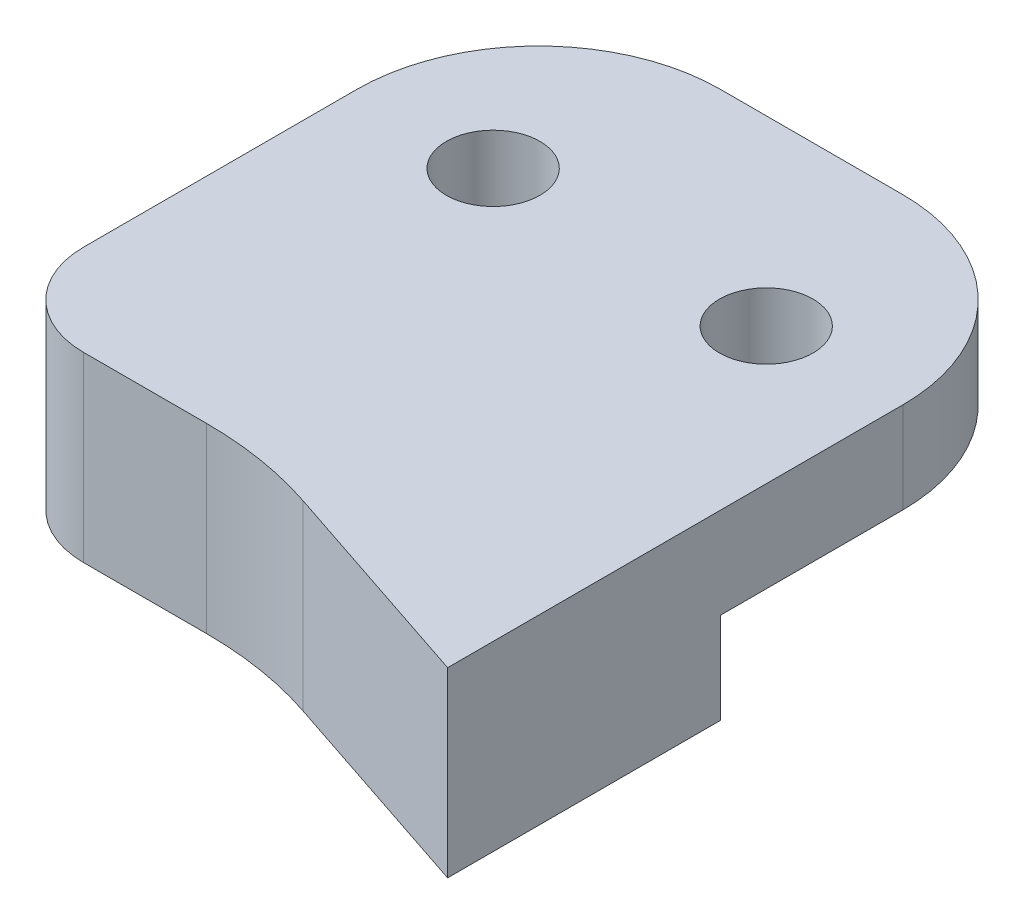
ISO-10303-21;
HEADER;
FILE_DESCRIPTION(('STEP AP214'),'2;1');
FILE_NAME('part.step','',(''),(''),'','','');
FILE_SCHEMA(('AUTOMOTIVE_DESIGN { 1 0 10303 214 1 1 1 1 }'));
ENDSEC;
DATA;
#1=APPLICATION_CONTEXT('core data for automotive mechanical design processes');
#2=APPLICATION_PROTOCOL_DEFINITION('international standard','automotive_design',2000,#1);
#3=PRODUCT_CONTEXT('',#1,'mechanical');
#4=PRODUCT('Part','Part','',(#3));
#5=PRODUCT_RELATED_PRODUCT_CATEGORY('part','',(#4));
#6=PRODUCT_DEFINITION_FORMATION('','',#4);
#7=PRODUCT_DEFINITION_CONTEXT('part definition',#1,'design');
#8=PRODUCT_DEFINITION('design','',#6,#7);
#9=PRODUCT_DEFINITION_SHAPE('','',#8);
#10=(LENGTH_UNIT() NAMED_UNIT(*) SI_UNIT(.MILLI.,.METRE.));
#11=(NAMED_UNIT(*) PLANE_ANGLE_UNIT() SI_UNIT($,.RADIAN.));
#12=(NAMED_UNIT(*) SI_UNIT($,.STERADIAN.) SOLID_ANGLE_UNIT());
#13=UNCERTAINTY_MEASURE_WITH_UNIT(LENGTH_MEASURE(1.E-05),#10,'distance_accuracy_value','');
#14=(GEOMETRIC_REPRESENTATION_CONTEXT(3) GLOBAL_UNCERTAINTY_ASSIGNED_CONTEXT((#13)) GLOBAL_UNIT_ASSIGNED_CONTEXT((#10,
#11,#12)) REPRESENTATION_CONTEXT('',''));
#15=CARTESIAN_POINT('',(0.,0.,0.));
#16=DIRECTION('',(0.,0.,1.));
#17=DIRECTION('',(1.,0.,0.));
#18=AXIS2_PLACEMENT_3D('',#15,#16,#17);
#19=CARTESIAN_POINT('',(0.,0.,0.));
#20=DIRECTION('',(0.,1.,0.));
#21=DIRECTION('',(0.,0.,1.));
#22=AXIS2_PLACEMENT_3D('',#19,#20,#21);
#23=PLANE('',#22);
#24=CARTESIAN_POINT('',(9.52500000000001,0.,-6.34999999999999));
#25=DIRECTION('',(0.,1.,0.));
#26=DIRECTION('',(0.,0.,1.));
#27=AXIS2_PLACEMENT_3D('',#24,#25,#26);
#28=CIRCLE('',#27,3.2639);
#29=CARTESIAN_POINT('',(9.52500000000001,0.,-3.08609999999999));
#30=VERTEX_POINT('',#29);
#31=EDGE_CURVE('E173',#30,#30,#28,.F.);
#32=ORIENTED_EDGE('',*,*,#31,.F.);
#33=EDGE_LOOP('',(#32));
#34=FACE_BOUND('',#33,.T.);
#35=CARTESIAN_POINT('',(-9.525,0.,-6.34999999999999));
#36=DIRECTION('',(0.,1.,0.));
#37=DIRECTION('',(0.,0.,1.));
#38=AXIS2_PLACEMENT_3D('',#35,#36,#37);
#39=CIRCLE('',#38,3.2639);
#40=CARTESIAN_POINT('',(-9.525,0.,-3.08609999999999));
#41=VERTEX_POINT('',#40);
#42=EDGE_CURVE('E195',#41,#41,#39,.T.);
#43=ORIENTED_EDGE('',*,*,#42,.T.);
#44=EDGE_LOOP('',(#43));
#45=FACE_BOUND('',#44,.T.);
#46=DIRECTION('',(-1.,0.,0.));
#47=VECTOR('',#46,1.);
#48=CARTESIAN_POINT('',(0.,0.,-19.05));
#49=LINE('',#48,#47);
#50=CARTESIAN_POINT('',(6.35,0.,-19.05));
#51=VERTEX_POINT('',#50);
#52=CARTESIAN_POINT('',(-6.35,0.,-19.05));
#53=VERTEX_POINT('',#52);
#54=EDGE_CURVE('E192',#51,#53,#49,.T.);
#55=ORIENTED_EDGE('',*,*,#54,.F.);
#56=CARTESIAN_POINT('',(6.35,0.,-6.34999999999999));
#57=DIRECTION('',(0.,1.,0.));
#58=DIRECTION('',(0.,0.,1.));
#59=AXIS2_PLACEMENT_3D('',#56,#57,#58);
#60=CIRCLE('',#59,12.7);
#61=CARTESIAN_POINT('',(19.05,0.,-6.34999999999999));
#62=VERTEX_POINT('',#61);
#63=EDGE_CURVE('E218',#51,#62,#60,.F.);
#64=ORIENTED_EDGE('',*,*,#63,.T.);
#65=DIRECTION('',(0.,0.,-1.));
#66=VECTOR('',#65,1.);
#67=CARTESIAN_POINT('',(19.05,0.,0.));
#68=LINE('',#67,#66);
#69=CARTESIAN_POINT('',(19.05,0.,6.35000000000001));
#70=VERTEX_POINT('',#69);
#71=EDGE_CURVE('E190',#70,#62,#68,.T.);
#72=ORIENTED_EDGE('',*,*,#71,.F.);
#73=DIRECTION('',(1.,0.,0.));
#74=VECTOR('',#73,1.);
#75=CARTESIAN_POINT('',(0.,0.,6.35000000000001));
#76=LINE('',#75,#74);
#77=CARTESIAN_POINT('',(-19.05,0.,6.35000000000001));
#78=VERTEX_POINT('',#77);
#79=EDGE_CURVE('E146',#78,#70,#76,.T.);
#80=ORIENTED_EDGE('',*,*,#79,.F.);
#81=DIRECTION('',(0.,0.,-1.));
#82=VECTOR('',#81,1.);
#83=CARTESIAN_POINT('',(-19.05,0.,0.));
#84=LINE('',#83,#82);
#85=CARTESIAN_POINT('',(-19.05,0.,-6.34999999999999));
#86=VERTEX_POINT('',#85);
#87=EDGE_CURVE('E167',#78,#86,#84,.T.);
#88=ORIENTED_EDGE('',*,*,#87,.T.);
#89=CARTESIAN_POINT('',(-6.35,0.,-6.34999999999999));
#90=DIRECTION('',(0.,1.,0.));
#91=DIRECTION('',(0.,0.,1.));
#92=AXIS2_PLACEMENT_3D('',#89,#90,#91);
#93=CIRCLE('',#92,12.7);
#94=EDGE_CURVE('E216',#86,#53,#93,.F.);
#95=ORIENTED_EDGE('',*,*,#94,.T.);
#96=EDGE_LOOP('',(#55,#64,#72,#80,#88,#95));
#97=FACE_BOUND('',#96,.T.);
#98=ADVANCED_FACE('F39',(#34,#45,#97),#23,.F.);
#99=CARTESIAN_POINT('',(-19.05,6.35,0.));
#100=DIRECTION('',(-1.,0.,0.));
#101=DIRECTION('',(0.,0.,1.));
#102=AXIS2_PLACEMENT_3D('',#99,#100,#101);
#103=PLANE('',#102);
#104=DIRECTION('',(0.,0.,-1.));
#105=VECTOR('',#104,1.);
#106=CARTESIAN_POINT('',(-19.05,6.35,0.));
#107=LINE('',#106,#105);
#108=CARTESIAN_POINT('',(-19.05,6.35,12.7));
#109=VERTEX_POINT('',#108);
#110=CARTESIAN_POINT('',(-19.05,6.35,-6.34999999999999));
#111=VERTEX_POINT('',#110);
#112=EDGE_CURVE('E170',#109,#111,#107,.T.);
#113=ORIENTED_EDGE('',*,*,#112,.T.);
#114=DIRECTION('',(0.,-1.,0.));
#115=VECTOR('',#114,1.);
#116=CARTESIAN_POINT('',(-19.05,0.,-6.34999999999999));
#117=LINE('',#116,#115);
#118=EDGE_CURVE('E11',#111,#86,#117,.T.);
#119=ORIENTED_EDGE('',*,*,#118,.T.);
#120=ORIENTED_EDGE('',*,*,#87,.F.);
#121=DIRECTION('',(0.,1.,0.));
#122=VECTOR('',#121,1.);
#123=CARTESIAN_POINT('',(-19.05,-6.35,6.35000000000001));
#124=LINE('',#123,#122);
#125=CARTESIAN_POINT('',(-19.05,-6.35,6.35000000000001));
#126=VERTEX_POINT('',#125);
#127=EDGE_CURVE('E164',#126,#78,#124,.T.);
#128=ORIENTED_EDGE('',*,*,#127,.F.);
#129=DIRECTION('',(0.,0.,-1.));
#130=VECTOR('',#129,1.);
#131=CARTESIAN_POINT('',(-19.05,-6.35,0.));
#132=LINE('',#131,#130);
#133=CARTESIAN_POINT('',(-19.05,-6.35,12.7));
#134=VERTEX_POINT('',#133);
#135=EDGE_CURVE('E157',#134,#126,#132,.T.);
#136=ORIENTED_EDGE('',*,*,#135,.F.);
#137=DIRECTION('',(0.,-1.,0.));
#138=VECTOR('',#137,1.);
#139=CARTESIAN_POINT('',(-19.05,6.35,12.7));
#140=LINE('',#139,#138);
#141=EDGE_CURVE('E207',#134,#109,#140,.F.);
#142=ORIENTED_EDGE('',*,*,#141,.T.);
#143=EDGE_LOOP('',(#113,#119,#120,#128,#136,#142));
#144=FACE_BOUND('',#143,.T.);
#145=ADVANCED_FACE('F241',(#144),#103,.T.);
#146=CARTESIAN_POINT('',(0.,6.35,19.05));
#147=DIRECTION('',(0.,0.,-1.));
#148=DIRECTION('',(-1.,0.,0.));
#149=AXIS2_PLACEMENT_3D('',#146,#147,#148);
#150=PLANE('',#149);
#151=DIRECTION('',(1.,0.,0.));
#152=VECTOR('',#151,1.);
#153=CARTESIAN_POINT('',(0.,6.35,19.05));
#154=LINE('',#153,#152);
#155=CARTESIAN_POINT('',(-12.7,6.35,19.05));
#156=VERTEX_POINT('',#155);
#157=CARTESIAN_POINT('',(-4.12185256827683,6.35,19.05));
#158=VERTEX_POINT('',#157);
#159=EDGE_CURVE('E172',#156,#158,#154,.T.);
#160=ORIENTED_EDGE('',*,*,#159,.F.);
#161=DIRECTION('',(0.,-1.,0.));
#162=VECTOR('',#161,1.);
#163=CARTESIAN_POINT('',(-12.7,-6.35,19.05));
#164=LINE('',#163,#162);
#165=CARTESIAN_POINT('',(-12.7,-6.35,19.05));
#166=VERTEX_POINT('',#165);
#167=EDGE_CURVE('E202',#156,#166,#164,.T.);
#168=ORIENTED_EDGE('',*,*,#167,.T.);
#169=DIRECTION('',(1.,0.,0.));
#170=VECTOR('',#169,1.);
#171=CARTESIAN_POINT('',(0.,-6.35,19.05));
#172=LINE('',#171,#170);
#173=CARTESIAN_POINT('',(-4.12185256827683,-6.35,19.05));
#174=VERTEX_POINT('',#173);
#175=EDGE_CURVE('E159',#166,#174,#172,.T.);
#176=ORIENTED_EDGE('',*,*,#175,.T.);
#177=DIRECTION('',(0.,-1.,0.));
#178=VECTOR('',#177,1.);
#179=CARTESIAN_POINT('',(-4.12185256827683,6.35,19.05));
#180=LINE('',#179,#178);
#181=EDGE_CURVE('E136',#158,#174,#180,.T.);
#182=ORIENTED_EDGE('',*,*,#181,.F.);
#183=EDGE_LOOP('',(#160,#168,#176,#182));
#184=FACE_BOUND('',#183,.T.);
#185=ADVANCED_FACE('F256',(#184),#150,.F.);
#186=CARTESIAN_POINT('',(-4.12185256827683,6.35,44.45));
#187=DIRECTION('',(0.,-1.,0.));
#188=DIRECTION('',(0.,0.,-1.));
#189=AXIS2_PLACEMENT_3D('',#186,#187,#188);
#190=CYLINDRICAL_SURFACE('',#189,25.4);
#191=ORIENTED_EDGE('',*,*,#181,.T.);
#192=CARTESIAN_POINT('',(-4.12185256827683,-6.35,44.45));
#193=DIRECTION('',(0.,1.,0.));
#194=DIRECTION('',(0.,0.,1.));
#195=AXIS2_PLACEMENT_3D('',#192,#193,#194);
#196=CIRCLE('',#195,25.4);
#197=CARTESIAN_POINT('',(3.91033268855086,-6.35,20.353444229517));
#198=VERTEX_POINT('',#197);
#199=EDGE_CURVE('E141',#198,#174,#196,.T.);
#200=ORIENTED_EDGE('',*,*,#199,.F.);
#201=DIRECTION('',(0.,-1.,0.));
#202=VECTOR('',#201,1.);
#203=CARTESIAN_POINT('',(3.91033268855086,6.35,20.353444229517));
#204=LINE('',#203,#202);
#205=CARTESIAN_POINT('',(3.91033268855086,6.35,20.353444229517));
#206=VERTEX_POINT('',#205);
#207=EDGE_CURVE('E126',#206,#198,#204,.T.);
#208=ORIENTED_EDGE('',*,*,#207,.F.);
#209=CARTESIAN_POINT('',(-4.12185256827683,6.35,44.45));
#210=DIRECTION('',(0.,1.,0.));
#211=DIRECTION('',(0.,0.,1.));
#212=AXIS2_PLACEMENT_3D('',#209,#210,#211);
#213=CIRCLE('',#212,25.4);
#214=EDGE_CURVE('E175',#206,#158,#213,.T.);
#215=ORIENTED_EDGE('',*,*,#214,.T.);
#216=EDGE_LOOP('',(#191,#200,#208,#215));
#217=FACE_BOUND('',#216,.T.);
#218=ADVANCED_FACE('F142',(#217),#190,.F.);
#219=CARTESIAN_POINT('',(-5.715,6.35,17.145));
#220=DIRECTION('',(0.316227766016838,0.,-0.948683298050514));
#221=DIRECTION('',(-0.948683298050514,0.,-0.316227766016838));
#222=AXIS2_PLACEMENT_3D('',#219,#220,#221);
#223=PLANE('',#222);
#224=ORIENTED_EDGE('',*,*,#207,.T.);
#225=DIRECTION('',(0.948683298050514,0.,0.316227766016838));
#226=VECTOR('',#225,1.);
#227=CARTESIAN_POINT('',(-5.715,-6.35,17.145));
#228=LINE('',#227,#226);
#229=CARTESIAN_POINT('',(19.05,-6.35,25.4));
#230=VERTEX_POINT('',#229);
#231=EDGE_CURVE('E131',#198,#230,#228,.T.);
#232=ORIENTED_EDGE('',*,*,#231,.T.);
#233=DIRECTION('',(0.,-1.,0.));
#234=VECTOR('',#233,1.);
#235=CARTESIAN_POINT('',(19.05,6.35,25.4));
#236=LINE('',#235,#234);
#237=CARTESIAN_POINT('',(19.05,6.35,25.4));
#238=VERTEX_POINT('',#237);
#239=EDGE_CURVE('E137',#238,#230,#236,.T.);
#240=ORIENTED_EDGE('',*,*,#239,.F.);
#241=DIRECTION('',(0.948683298050514,0.,0.316227766016838));
#242=VECTOR('',#241,1.);
#243=CARTESIAN_POINT('',(-5.715,6.35,17.145));
#244=LINE('',#243,#242);
#245=EDGE_CURVE('E132',#206,#238,#244,.T.);
#246=ORIENTED_EDGE('',*,*,#245,.F.);
#247=EDGE_LOOP('',(#224,#232,#240,#246));
#248=FACE_BOUND('',#247,.T.);
#249=ADVANCED_FACE('F128',(#248),#223,.F.);
#250=CARTESIAN_POINT('',(19.05,6.35,0.));
#251=DIRECTION('',(-1.,0.,0.));
#252=DIRECTION('',(0.,0.,1.));
#253=AXIS2_PLACEMENT_3D('',#250,#251,#252);
#254=PLANE('',#253);
#255=ORIENTED_EDGE('',*,*,#71,.T.);
#256=DIRECTION('',(0.,-1.,0.));
#257=VECTOR('',#256,1.);
#258=CARTESIAN_POINT('',(19.05,6.35,-6.34999999999999));
#259=LINE('',#258,#257);
#260=CARTESIAN_POINT('',(19.05,6.35,-6.34999999999999));
#261=VERTEX_POINT('',#260);
#262=EDGE_CURVE('E62',#62,#261,#259,.F.);
#263=ORIENTED_EDGE('',*,*,#262,.T.);
#264=DIRECTION('',(0.,0.,-1.));
#265=VECTOR('',#264,1.);
#266=CARTESIAN_POINT('',(19.05,6.35,0.));
#267=LINE('',#266,#265);
#268=EDGE_CURVE('E178',#238,#261,#267,.T.);
#269=ORIENTED_EDGE('',*,*,#268,.F.);
#270=ORIENTED_EDGE('',*,*,#239,.T.);
#271=DIRECTION('',(0.,0.,-1.));
#272=VECTOR('',#271,1.);
#273=CARTESIAN_POINT('',(19.05,-6.35,0.));
#274=LINE('',#273,#272);
#275=CARTESIAN_POINT('',(19.05,-6.35,6.35000000000001));
#276=VERTEX_POINT('',#275);
#277=EDGE_CURVE('E151',#230,#276,#274,.T.);
#278=ORIENTED_EDGE('',*,*,#277,.T.);
#279=DIRECTION('',(0.,1.,0.));
#280=VECTOR('',#279,1.);
#281=CARTESIAN_POINT('',(19.05,-6.35,6.35000000000001));
#282=LINE('',#281,#280);
#283=EDGE_CURVE('E161',#276,#70,#282,.T.);
#284=ORIENTED_EDGE('',*,*,#283,.T.);
#285=EDGE_LOOP('',(#255,#263,#269,#270,#278,#284));
#286=FACE_BOUND('',#285,.T.);
#287=ADVANCED_FACE('F233',(#286),#254,.F.);
#288=CARTESIAN_POINT('',(-9.525,6.35,-6.34999999999999));
#289=DIRECTION('',(0.,-1.,0.));
#290=DIRECTION('',(0.,0.,-1.));
#291=AXIS2_PLACEMENT_3D('',#288,#289,#290);
#292=CYLINDRICAL_SURFACE('',#291,3.2639);
#293=CARTESIAN_POINT('',(-9.525,6.35,-6.34999999999999));
#294=DIRECTION('',(0.,1.,0.));
#295=DIRECTION('',(0.,0.,1.));
#296=AXIS2_PLACEMENT_3D('',#293,#294,#295);
#297=CIRCLE('',#296,3.2639);
#298=CARTESIAN_POINT('',(-9.525,6.35,-3.08609999999999));
#299=VERTEX_POINT('',#298);
#300=EDGE_CURVE('E182',#299,#299,#297,.T.);
#301=ORIENTED_EDGE('',*,*,#300,.T.);
#302=EDGE_LOOP('',(#301));
#303=FACE_BOUND('',#302,.T.);
#304=ORIENTED_EDGE('',*,*,#42,.F.);
#305=EDGE_LOOP('',(#304));
#306=FACE_BOUND('',#305,.T.);
#307=ADVANCED_FACE('F267',(#303,#306),#292,.F.);
#308=CARTESIAN_POINT('',(0.,6.35,-19.05));
#309=DIRECTION('',(0.,0.,1.));
#310=DIRECTION('',(1.,0.,0.));
#311=AXIS2_PLACEMENT_3D('',#308,#309,#310);
#312=PLANE('',#311);
#313=DIRECTION('',(-1.,0.,0.));
#314=VECTOR('',#313,1.);
#315=CARTESIAN_POINT('',(0.,6.35,-19.05));
#316=LINE('',#315,#314);
#317=CARTESIAN_POINT('',(6.35,6.35,-19.05));
#318=VERTEX_POINT('',#317);
#319=CARTESIAN_POINT('',(-6.35,6.35,-19.05));
#320=VERTEX_POINT('',#319);
#321=EDGE_CURVE('E180',#318,#320,#316,.T.);
#322=ORIENTED_EDGE('',*,*,#321,.F.);
#323=DIRECTION('',(0.,-1.,0.));
#324=VECTOR('',#323,1.);
#325=CARTESIAN_POINT('',(6.35,6.35,-19.05));
#326=LINE('',#325,#324);
#327=EDGE_CURVE('E213',#318,#51,#326,.T.);
#328=ORIENTED_EDGE('',*,*,#327,.T.);
#329=ORIENTED_EDGE('',*,*,#54,.T.);
#330=DIRECTION('',(0.,-1.,0.));
#331=VECTOR('',#330,1.);
#332=CARTESIAN_POINT('',(-6.35,6.35,-19.05));
#333=LINE('',#332,#331);
#334=EDGE_CURVE('E211',#53,#320,#333,.F.);
#335=ORIENTED_EDGE('',*,*,#334,.T.);
#336=EDGE_LOOP('',(#322,#328,#329,#335));
#337=FACE_BOUND('',#336,.T.);
#338=ADVANCED_FACE('F228',(#337),#312,.F.);
#339=CARTESIAN_POINT('',(9.52500000000001,6.35,-6.34999999999999));
#340=DIRECTION('',(0.,-1.,0.));
#341=DIRECTION('',(0.,0.,-1.));
#342=AXIS2_PLACEMENT_3D('',#339,#340,#341);
#343=CYLINDRICAL_SURFACE('',#342,3.2639);
#344=CARTESIAN_POINT('',(9.52500000000001,6.35,-6.34999999999999));
#345=DIRECTION('',(0.,1.,0.));
#346=DIRECTION('',(0.,0.,1.));
#347=AXIS2_PLACEMENT_3D('',#344,#345,#346);
#348=CIRCLE('',#347,3.2639);
#349=CARTESIAN_POINT('',(9.52500000000001,6.35,-3.08609999999999));
#350=VERTEX_POINT('',#349);
#351=EDGE_CURVE('E185',#350,#350,#348,.F.);
#352=ORIENTED_EDGE('',*,*,#351,.F.);
#353=EDGE_LOOP('',(#352));
#354=FACE_BOUND('',#353,.T.);
#355=ORIENTED_EDGE('',*,*,#31,.T.);
#356=EDGE_LOOP('',(#355));
#357=FACE_BOUND('',#356,.T.);
#358=ADVANCED_FACE('F263',(#354,#357),#343,.F.);
#359=CARTESIAN_POINT('',(0.,6.35,0.));
#360=DIRECTION('',(0.,1.,0.));
#361=DIRECTION('',(0.,0.,1.));
#362=AXIS2_PLACEMENT_3D('',#359,#360,#361);
#363=PLANE('',#362);
#364=ORIENTED_EDGE('',*,*,#268,.T.);
#365=CARTESIAN_POINT('',(6.35,6.35,-6.34999999999999));
#366=DIRECTION('',(0.,1.,0.));
#367=DIRECTION('',(0.,0.,1.));
#368=AXIS2_PLACEMENT_3D('',#365,#366,#367);
#369=CIRCLE('',#368,12.7);
#370=EDGE_CURVE('E47',#261,#318,#369,.T.);
#371=ORIENTED_EDGE('',*,*,#370,.T.);
#372=ORIENTED_EDGE('',*,*,#321,.T.);
#373=CARTESIAN_POINT('',(-6.35,6.35,-6.34999999999999));
#374=DIRECTION('',(0.,1.,0.));
#375=DIRECTION('',(0.,0.,1.));
#376=AXIS2_PLACEMENT_3D('',#373,#374,#375);
#377=CIRCLE('',#376,12.7);
#378=EDGE_CURVE('E54',#320,#111,#377,.T.);
#379=ORIENTED_EDGE('',*,*,#378,.T.);
#380=ORIENTED_EDGE('',*,*,#112,.F.);
#381=CARTESIAN_POINT('',(-12.7,6.35,12.7));
#382=DIRECTION('',(0.,1.,0.));
#383=DIRECTION('',(0.,0.,1.));
#384=AXIS2_PLACEMENT_3D('',#381,#382,#383);
#385=CIRCLE('',#384,6.35);
#386=EDGE_CURVE('E209',#109,#156,#385,.T.);
#387=ORIENTED_EDGE('',*,*,#386,.T.);
#388=ORIENTED_EDGE('',*,*,#159,.T.);
#389=ORIENTED_EDGE('',*,*,#214,.F.);
#390=ORIENTED_EDGE('',*,*,#245,.T.);
#391=EDGE_LOOP('',(#364,#371,#372,#379,#380,#387,#388,#389,#390));
#392=FACE_BOUND('',#391,.T.);
#393=ORIENTED_EDGE('',*,*,#300,.F.);
#394=EDGE_LOOP('',(#393));
#395=FACE_BOUND('',#394,.T.);
#396=ORIENTED_EDGE('',*,*,#351,.T.);
#397=EDGE_LOOP('',(#396));
#398=FACE_BOUND('',#397,.T.);
#399=ADVANCED_FACE('F223',(#392,#395,#398),#363,.T.);
#400=CARTESIAN_POINT('',(0.,-6.35,6.35000000000001));
#401=DIRECTION('',(0.,0.,1.));
#402=DIRECTION('',(1.,0.,0.));
#403=AXIS2_PLACEMENT_3D('',#400,#401,#402);
#404=PLANE('',#403);
#405=ORIENTED_EDGE('',*,*,#79,.T.);
#406=ORIENTED_EDGE('',*,*,#283,.F.);
#407=DIRECTION('',(1.,0.,0.));
#408=VECTOR('',#407,1.);
#409=CARTESIAN_POINT('',(0.,-6.35,6.35000000000001));
#410=LINE('',#409,#408);
#411=EDGE_CURVE('E153',#126,#276,#410,.T.);
#412=ORIENTED_EDGE('',*,*,#411,.F.);
#413=ORIENTED_EDGE('',*,*,#127,.T.);
#414=EDGE_LOOP('',(#405,#406,#412,#413));
#415=FACE_BOUND('',#414,.T.);
#416=ADVANCED_FACE('F237',(#415),#404,.F.);
#417=CARTESIAN_POINT('',(0.,-6.35,0.));
#418=DIRECTION('',(0.,1.,0.));
#419=DIRECTION('',(0.,0.,1.));
#420=AXIS2_PLACEMENT_3D('',#417,#418,#419);
#421=PLANE('',#420);
#422=ORIENTED_EDGE('',*,*,#175,.F.);
#423=CARTESIAN_POINT('',(-12.7,-6.35,12.7));
#424=DIRECTION('',(0.,1.,0.));
#425=DIRECTION('',(0.,0.,1.));
#426=AXIS2_PLACEMENT_3D('',#423,#424,#425);
#427=CIRCLE('',#426,6.35);
#428=EDGE_CURVE('E205',#166,#134,#427,.F.);
#429=ORIENTED_EDGE('',*,*,#428,.T.);
#430=ORIENTED_EDGE('',*,*,#135,.T.);
#431=ORIENTED_EDGE('',*,*,#411,.T.);
#432=ORIENTED_EDGE('',*,*,#277,.F.);
#433=ORIENTED_EDGE('',*,*,#231,.F.);
#434=ORIENTED_EDGE('',*,*,#199,.T.);
#435=EDGE_LOOP('',(#422,#429,#430,#431,#432,#433,#434));
#436=FACE_BOUND('',#435,.T.);
#437=ADVANCED_FACE('F149',(#436),#421,.F.);
#438=CARTESIAN_POINT('',(-12.7,6.35,12.7));
#439=DIRECTION('',(0.,1.,0.));
#440=DIRECTION('',(0.,0.,1.));
#441=AXIS2_PLACEMENT_3D('',#438,#439,#440);
#442=CYLINDRICAL_SURFACE('',#441,6.35);
#443=ORIENTED_EDGE('',*,*,#386,.F.);
#444=ORIENTED_EDGE('',*,*,#141,.F.);
#445=ORIENTED_EDGE('',*,*,#428,.F.);
#446=ORIENTED_EDGE('',*,*,#167,.F.);
#447=EDGE_LOOP('',(#443,#444,#445,#446));
#448=FACE_BOUND('',#447,.T.);
#449=ADVANCED_FACE('F249',(#448),#442,.T.);
#450=CARTESIAN_POINT('',(6.35,6.35,-6.34999999999999));
#451=DIRECTION('',(0.,-1.,0.));
#452=DIRECTION('',(0.,0.,-1.));
#453=AXIS2_PLACEMENT_3D('',#450,#451,#452);
#454=CYLINDRICAL_SURFACE('',#453,12.7);
#455=ORIENTED_EDGE('',*,*,#370,.F.);
#456=ORIENTED_EDGE('',*,*,#262,.F.);
#457=ORIENTED_EDGE('',*,*,#63,.F.);
#458=ORIENTED_EDGE('',*,*,#327,.F.);
#459=EDGE_LOOP('',(#455,#456,#457,#458));
#460=FACE_BOUND('',#459,.T.);
#461=ADVANCED_FACE('F231',(#460),#454,.T.);
#462=CARTESIAN_POINT('',(-6.35,6.35,-6.34999999999999));
#463=DIRECTION('',(0.,1.,0.));
#464=DIRECTION('',(0.,0.,1.));
#465=AXIS2_PLACEMENT_3D('',#462,#463,#464);
#466=CYLINDRICAL_SURFACE('',#465,12.7);
#467=ORIENTED_EDGE('',*,*,#378,.F.);
#468=ORIENTED_EDGE('',*,*,#334,.F.);
#469=ORIENTED_EDGE('',*,*,#94,.F.);
#470=ORIENTED_EDGE('',*,*,#118,.F.);
#471=EDGE_LOOP('',(#467,#468,#469,#470));
#472=FACE_BOUND('',#471,.T.);
#473=ADVANCED_FACE('F41',(#472),#466,.T.);
#474=CLOSED_SHELL('',(#98,#145,#185,#218,#249,#287,#307,#338,#358,#399,#416,#437,#449,#461,#473));
#475=MANIFOLD_SOLID_BREP('B2',#474);
#476=ADVANCED_BREP_SHAPE_REPRESENTATION('',(#18,#475),#14);
#477=SHAPE_DEFINITION_REPRESENTATION(#9,#476);
ENDSEC;
END-ISO-10303-21;
